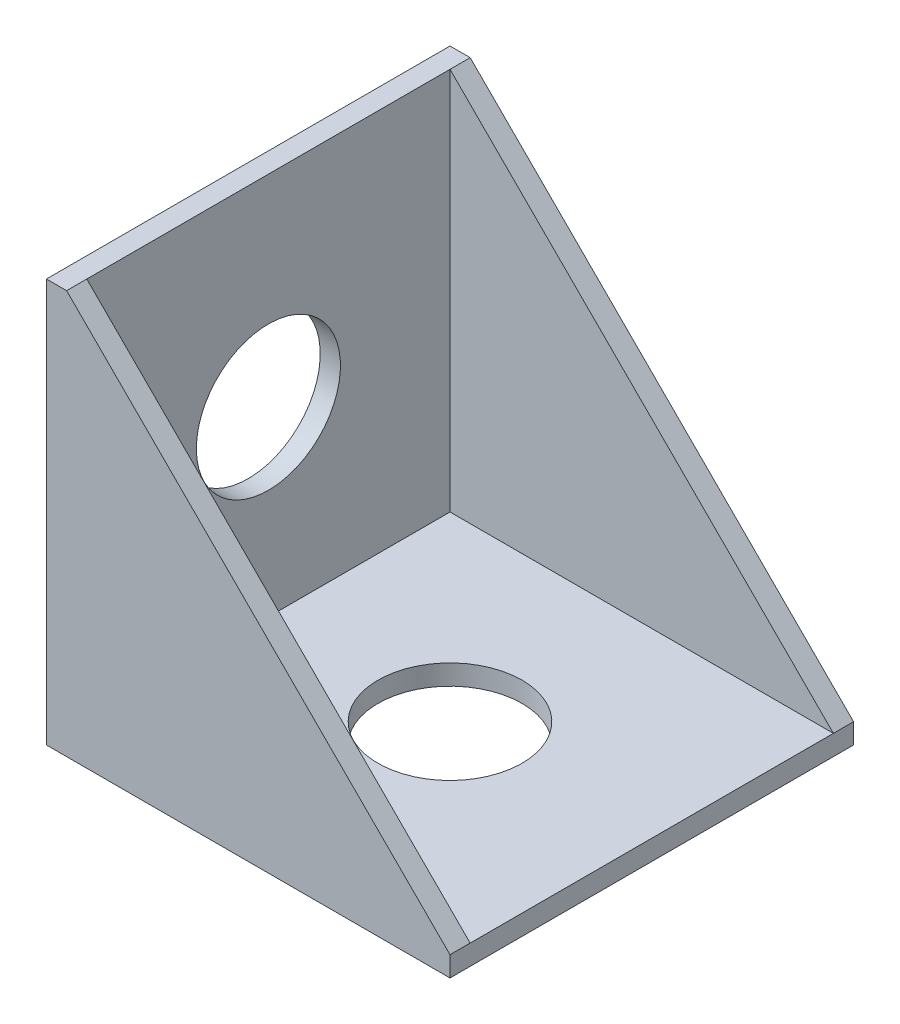
ISO-10303-21;
HEADER;
FILE_DESCRIPTION(('STEP AP214'),'2;1');
FILE_NAME('part.step','',(''),(''),'','','');
FILE_SCHEMA(('AUTOMOTIVE_DESIGN { 1 0 10303 214 1 1 1 1 }'));
ENDSEC;
DATA;
#1=APPLICATION_CONTEXT('core data for automotive mechanical design processes');
#2=APPLICATION_PROTOCOL_DEFINITION('international standard','automotive_design',2000,#1);
#3=PRODUCT_CONTEXT('',#1,'mechanical');
#4=PRODUCT('Part','Part','',(#3));
#5=PRODUCT_RELATED_PRODUCT_CATEGORY('part','',(#4));
#6=PRODUCT_DEFINITION_FORMATION('','',#4);
#7=PRODUCT_DEFINITION_CONTEXT('part definition',#1,'design');
#8=PRODUCT_DEFINITION('design','',#6,#7);
#9=PRODUCT_DEFINITION_SHAPE('','',#8);
#10=(LENGTH_UNIT() NAMED_UNIT(*) SI_UNIT(.MILLI.,.METRE.));
#11=(NAMED_UNIT(*) PLANE_ANGLE_UNIT() SI_UNIT($,.RADIAN.));
#12=(NAMED_UNIT(*) SI_UNIT($,.STERADIAN.) SOLID_ANGLE_UNIT());
#13=UNCERTAINTY_MEASURE_WITH_UNIT(LENGTH_MEASURE(1.E-05),#10,'distance_accuracy_value','');
#14=(GEOMETRIC_REPRESENTATION_CONTEXT(3) GLOBAL_UNCERTAINTY_ASSIGNED_CONTEXT((#13)) GLOBAL_UNIT_ASSIGNED_CONTEXT((#10,
#11,#12)) REPRESENTATION_CONTEXT('',''));
#15=CARTESIAN_POINT('',(0.,0.,0.));
#16=DIRECTION('',(0.,0.,1.));
#17=DIRECTION('',(1.,0.,0.));
#18=AXIS2_PLACEMENT_3D('',#15,#16,#17);
#19=CARTESIAN_POINT('',(20.,1.,0.));
#20=DIRECTION('',(0.707106781186547,0.707106781186548,0.));
#21=DIRECTION('',(0.,0.,-1.));
#22=AXIS2_PLACEMENT_3D('',#19,#20,#21);
#23=PLANE('',#22);
#24=DIRECTION('',(0.,0.,1.));
#25=VECTOR('',#24,1.);
#26=CARTESIAN_POINT('',(0.999999999999985,20.,0.));
#27=LINE('',#26,#25);
#28=CARTESIAN_POINT('',(0.999999999999985,20.,-10.));
#29=VERTEX_POINT('',#28);
#30=CARTESIAN_POINT('',(0.999999999999984,20.,-9.));
#31=VERTEX_POINT('',#30);
#32=EDGE_CURVE('E158',#29,#31,#27,.T.);
#33=ORIENTED_EDGE('',*,*,#32,.T.);
#34=DIRECTION('',(-0.707106781186548,0.707106781186547,0.));
#35=VECTOR('',#34,1.);
#36=CARTESIAN_POINT('',(20.,1.,-9.));
#37=LINE('',#36,#35);
#38=CARTESIAN_POINT('',(20.,1.,-9.));
#39=VERTEX_POINT('',#38);
#40=EDGE_CURVE('E48',#39,#31,#37,.T.);
#41=ORIENTED_EDGE('',*,*,#40,.F.);
#42=DIRECTION('',(0.,0.,1.));
#43=VECTOR('',#42,1.);
#44=CARTESIAN_POINT('',(20.,1.,0.));
#45=LINE('',#44,#43);
#46=CARTESIAN_POINT('',(20.,1.,-10.));
#47=VERTEX_POINT('',#46);
#48=EDGE_CURVE('E169',#47,#39,#45,.T.);
#49=ORIENTED_EDGE('',*,*,#48,.F.);
#50=DIRECTION('',(0.707106781186548,-0.707106781186547,0.));
#51=VECTOR('',#50,1.);
#52=CARTESIAN_POINT('',(20.,1.,-10.));
#53=LINE('',#52,#51);
#54=EDGE_CURVE('E175',#29,#47,#53,.T.);
#55=ORIENTED_EDGE('',*,*,#54,.F.);
#56=EDGE_LOOP('',(#33,#41,#49,#55));
#57=FACE_BOUND('',#56,.T.);
#58=ADVANCED_FACE('F40',(#57),#23,.T.);
#59=CARTESIAN_POINT('',(0.,10.,0.));
#60=DIRECTION('',(1.,0.,0.));
#61=DIRECTION('',(0.,0.,-1.));
#62=AXIS2_PLACEMENT_3D('',#59,#60,#61);
#63=CYLINDRICAL_SURFACE('',#62,3.57);
#64=CARTESIAN_POINT('',(0.999999999999985,10.,0.));
#65=DIRECTION('',(-1.,0.,0.));
#66=DIRECTION('',(0.,0.,1.));
#67=AXIS2_PLACEMENT_3D('',#64,#65,#66);
#68=CIRCLE('',#67,3.57);
#69=CARTESIAN_POINT('',(0.999999999999985,10.,3.57));
#70=VERTEX_POINT('',#69);
#71=EDGE_CURVE('E135',#70,#70,#68,.F.);
#72=ORIENTED_EDGE('',*,*,#71,.T.);
#73=EDGE_LOOP('',(#72));
#74=FACE_BOUND('',#73,.T.);
#75=CARTESIAN_POINT('',(0.,10.,0.));
#76=DIRECTION('',(1.,0.,0.));
#77=DIRECTION('',(0.,0.,-1.));
#78=AXIS2_PLACEMENT_3D('',#75,#76,#77);
#79=CIRCLE('',#78,3.57);
#80=CARTESIAN_POINT('',(0.,10.,3.57));
#81=VERTEX_POINT('',#80);
#82=EDGE_CURVE('E148',#81,#81,#79,.T.);
#83=ORIENTED_EDGE('',*,*,#82,.F.);
#84=EDGE_LOOP('',(#83));
#85=FACE_BOUND('',#84,.T.);
#86=ADVANCED_FACE('F42',(#74,#85),#63,.F.);
#87=CARTESIAN_POINT('',(10.,0.,0.));
#88=DIRECTION('',(0.,1.,0.));
#89=DIRECTION('',(-1.,0.,0.));
#90=AXIS2_PLACEMENT_3D('',#87,#88,#89);
#91=CYLINDRICAL_SURFACE('',#90,3.57);
#92=CARTESIAN_POINT('',(10.,1.,0.));
#93=DIRECTION('',(0.,-1.,0.));
#94=DIRECTION('',(0.,0.,-1.));
#95=AXIS2_PLACEMENT_3D('',#92,#93,#94);
#96=CIRCLE('',#95,3.57);
#97=CARTESIAN_POINT('',(10.,1.,-3.57));
#98=VERTEX_POINT('',#97);
#99=EDGE_CURVE('E117',#98,#98,#96,.F.);
#100=ORIENTED_EDGE('',*,*,#99,.T.);
#101=EDGE_LOOP('',(#100));
#102=FACE_BOUND('',#101,.T.);
#103=CARTESIAN_POINT('',(10.,0.,0.));
#104=DIRECTION('',(0.,1.,0.));
#105=DIRECTION('',(-1.,0.,0.));
#106=AXIS2_PLACEMENT_3D('',#103,#104,#105);
#107=CIRCLE('',#106,3.57);
#108=CARTESIAN_POINT('',(13.57,0.,0.));
#109=VERTEX_POINT('',#108);
#110=EDGE_CURVE('E164',#109,#109,#107,.T.);
#111=ORIENTED_EDGE('',*,*,#110,.F.);
#112=EDGE_LOOP('',(#111));
#113=FACE_BOUND('',#112,.T.);
#114=ADVANCED_FACE('F230',(#102,#113),#91,.F.);
#115=CARTESIAN_POINT('',(7.29831834890795,7.29831834890795,-10.));
#116=DIRECTION('',(0.,0.,-1.));
#117=DIRECTION('',(0.,-1.,0.));
#118=AXIS2_PLACEMENT_3D('',#115,#116,#117);
#119=PLANE('',#118);
#120=DIRECTION('',(-1.,0.,0.));
#121=VECTOR('',#120,1.);
#122=CARTESIAN_POINT('',(0.,0.,-10.));
#123=LINE('',#122,#121);
#124=CARTESIAN_POINT('',(20.,0.,-10.));
#125=VERTEX_POINT('',#124);
#126=CARTESIAN_POINT('',(0.,0.,-10.));
#127=VERTEX_POINT('',#126);
#128=EDGE_CURVE('E156',#125,#127,#123,.T.);
#129=ORIENTED_EDGE('',*,*,#128,.T.);
#130=DIRECTION('',(0.,1.,0.));
#131=VECTOR('',#130,1.);
#132=CARTESIAN_POINT('',(0.,20.,-10.));
#133=LINE('',#132,#131);
#134=CARTESIAN_POINT('',(0.,20.,-10.));
#135=VERTEX_POINT('',#134);
#136=EDGE_CURVE('E153',#127,#135,#133,.T.);
#137=ORIENTED_EDGE('',*,*,#136,.T.);
#138=DIRECTION('',(1.,0.,0.));
#139=VECTOR('',#138,1.);
#140=CARTESIAN_POINT('',(0.999999999999985,20.,-10.));
#141=LINE('',#140,#139);
#142=EDGE_CURVE('E157',#135,#29,#141,.T.);
#143=ORIENTED_EDGE('',*,*,#142,.T.);
#144=ORIENTED_EDGE('',*,*,#54,.T.);
#145=DIRECTION('',(0.,-1.,0.));
#146=VECTOR('',#145,1.);
#147=CARTESIAN_POINT('',(20.,0.,-10.));
#148=LINE('',#147,#146);
#149=EDGE_CURVE('E151',#47,#125,#148,.T.);
#150=ORIENTED_EDGE('',*,*,#149,.T.);
#151=EDGE_LOOP('',(#129,#137,#143,#144,#150));
#152=FACE_BOUND('',#151,.T.);
#153=ADVANCED_FACE('F243',(#152),#119,.T.);
#154=CARTESIAN_POINT('',(0.,20.,0.));
#155=DIRECTION('',(-1.,0.,0.));
#156=DIRECTION('',(0.,1.,0.));
#157=AXIS2_PLACEMENT_3D('',#154,#155,#156);
#158=PLANE('',#157);
#159=ORIENTED_EDGE('',*,*,#82,.T.);
#160=EDGE_LOOP('',(#159));
#161=FACE_BOUND('',#160,.T.);
#162=DIRECTION('',(0.,0.,-1.));
#163=VECTOR('',#162,1.);
#164=CARTESIAN_POINT('',(0.,0.,0.));
#165=LINE('',#164,#163);
#166=CARTESIAN_POINT('',(0.,0.,10.));
#167=VERTEX_POINT('',#166);
#168=EDGE_CURVE('E143',#167,#127,#165,.T.);
#169=ORIENTED_EDGE('',*,*,#168,.F.);
#170=DIRECTION('',(0.,-1.,0.));
#171=VECTOR('',#170,1.);
#172=CARTESIAN_POINT('',(0.,20.,10.));
#173=LINE('',#172,#171);
#174=CARTESIAN_POINT('',(0.,20.,10.));
#175=VERTEX_POINT('',#174);
#176=EDGE_CURVE('E142',#175,#167,#173,.T.);
#177=ORIENTED_EDGE('',*,*,#176,.F.);
#178=DIRECTION('',(0.,0.,1.));
#179=VECTOR('',#178,1.);
#180=CARTESIAN_POINT('',(0.,20.,0.));
#181=LINE('',#180,#179);
#182=EDGE_CURVE('E152',#135,#175,#181,.T.);
#183=ORIENTED_EDGE('',*,*,#182,.F.);
#184=ORIENTED_EDGE('',*,*,#136,.F.);
#185=EDGE_LOOP('',(#169,#177,#183,#184));
#186=FACE_BOUND('',#185,.T.);
#187=ADVANCED_FACE('F204',(#161,#186),#158,.T.);
#188=CARTESIAN_POINT('',(0.999999999999985,20.,0.));
#189=DIRECTION('',(0.,1.,0.));
#190=DIRECTION('',(1.,0.,0.));
#191=AXIS2_PLACEMENT_3D('',#188,#189,#190);
#192=PLANE('',#191);
#193=ORIENTED_EDGE('',*,*,#182,.T.);
#194=DIRECTION('',(-1.,0.,0.));
#195=VECTOR('',#194,1.);
#196=CARTESIAN_POINT('',(0.999999999999985,20.,10.));
#197=LINE('',#196,#195);
#198=CARTESIAN_POINT('',(0.999999999999985,20.,10.));
#199=VERTEX_POINT('',#198);
#200=EDGE_CURVE('E165',#199,#175,#197,.T.);
#201=ORIENTED_EDGE('',*,*,#200,.F.);
#202=CARTESIAN_POINT('',(0.999999999999985,20.,9.));
#203=VERTEX_POINT('',#202);
#204=EDGE_CURVE('E161',#203,#199,#27,.T.);
#205=ORIENTED_EDGE('',*,*,#204,.F.);
#206=DIRECTION('',(0.,0.,1.));
#207=VECTOR('',#206,1.);
#208=CARTESIAN_POINT('',(0.999999999999984,20.,-9.));
#209=LINE('',#208,#207);
#210=EDGE_CURVE('E130',#31,#203,#209,.T.);
#211=ORIENTED_EDGE('',*,*,#210,.F.);
#212=ORIENTED_EDGE('',*,*,#32,.F.);
#213=ORIENTED_EDGE('',*,*,#142,.F.);
#214=EDGE_LOOP('',(#193,#201,#205,#211,#212,#213));
#215=FACE_BOUND('',#214,.T.);
#216=ADVANCED_FACE('F199',(#215),#192,.T.);
#217=DIRECTION('',(0.707106781186548,-0.707106781186547,0.));
#218=VECTOR('',#217,1.);
#219=CARTESIAN_POINT('',(20.,0.999999999999999,9.));
#220=LINE('',#219,#218);
#221=CARTESIAN_POINT('',(20.,1.,9.));
#222=VERTEX_POINT('',#221);
#223=EDGE_CURVE('E11',#203,#222,#220,.T.);
#224=ORIENTED_EDGE('',*,*,#223,.F.);
#225=ORIENTED_EDGE('',*,*,#204,.T.);
#226=DIRECTION('',(-0.707106781186548,0.707106781186547,0.));
#227=VECTOR('',#226,1.);
#228=CARTESIAN_POINT('',(20.,1.,10.));
#229=LINE('',#228,#227);
#230=CARTESIAN_POINT('',(20.,1.,10.));
#231=VERTEX_POINT('',#230);
#232=EDGE_CURVE('E168',#231,#199,#229,.T.);
#233=ORIENTED_EDGE('',*,*,#232,.F.);
#234=EDGE_CURVE('E172',#222,#231,#45,.T.);
#235=ORIENTED_EDGE('',*,*,#234,.F.);
#236=EDGE_LOOP('',(#224,#225,#233,#235));
#237=FACE_BOUND('',#236,.T.);
#238=ADVANCED_FACE('F196',(#237),#23,.T.);
#239=CARTESIAN_POINT('',(20.,0.,0.));
#240=DIRECTION('',(1.,0.,0.));
#241=DIRECTION('',(0.,1.,0.));
#242=AXIS2_PLACEMENT_3D('',#239,#240,#241);
#243=PLANE('',#242);
#244=ORIENTED_EDGE('',*,*,#48,.T.);
#245=DIRECTION('',(0.,0.,-1.));
#246=VECTOR('',#245,1.);
#247=CARTESIAN_POINT('',(20.,1.,9.));
#248=LINE('',#247,#246);
#249=EDGE_CURVE('E113',#222,#39,#248,.T.);
#250=ORIENTED_EDGE('',*,*,#249,.F.);
#251=ORIENTED_EDGE('',*,*,#234,.T.);
#252=DIRECTION('',(0.,1.,0.));
#253=VECTOR('',#252,1.);
#254=CARTESIAN_POINT('',(20.,0.,10.));
#255=LINE('',#254,#253);
#256=CARTESIAN_POINT('',(20.,0.,10.));
#257=VERTEX_POINT('',#256);
#258=EDGE_CURVE('E184',#257,#231,#255,.T.);
#259=ORIENTED_EDGE('',*,*,#258,.F.);
#260=DIRECTION('',(0.,0.,1.));
#261=VECTOR('',#260,1.);
#262=CARTESIAN_POINT('',(20.,0.,0.));
#263=LINE('',#262,#261);
#264=EDGE_CURVE('E146',#125,#257,#263,.T.);
#265=ORIENTED_EDGE('',*,*,#264,.F.);
#266=ORIENTED_EDGE('',*,*,#149,.F.);
#267=EDGE_LOOP('',(#244,#250,#251,#259,#265,#266));
#268=FACE_BOUND('',#267,.T.);
#269=ADVANCED_FACE('F211',(#268),#243,.T.);
#270=CARTESIAN_POINT('',(0.,0.,0.));
#271=DIRECTION('',(0.,-1.,0.));
#272=DIRECTION('',(0.,0.,-1.));
#273=AXIS2_PLACEMENT_3D('',#270,#271,#272);
#274=PLANE('',#273);
#275=ORIENTED_EDGE('',*,*,#110,.T.);
#276=EDGE_LOOP('',(#275));
#277=FACE_BOUND('',#276,.T.);
#278=ORIENTED_EDGE('',*,*,#264,.T.);
#279=DIRECTION('',(1.,0.,0.));
#280=VECTOR('',#279,1.);
#281=CARTESIAN_POINT('',(0.,0.,10.));
#282=LINE('',#281,#280);
#283=EDGE_CURVE('E147',#167,#257,#282,.T.);
#284=ORIENTED_EDGE('',*,*,#283,.F.);
#285=ORIENTED_EDGE('',*,*,#168,.T.);
#286=ORIENTED_EDGE('',*,*,#128,.F.);
#287=EDGE_LOOP('',(#278,#284,#285,#286));
#288=FACE_BOUND('',#287,.T.);
#289=ADVANCED_FACE('F207',(#277,#288),#274,.T.);
#290=CARTESIAN_POINT('',(7.29831834890795,7.29831834890795,10.));
#291=DIRECTION('',(0.,0.,1.));
#292=DIRECTION('',(1.,0.,0.));
#293=AXIS2_PLACEMENT_3D('',#290,#291,#292);
#294=PLANE('',#293);
#295=ORIENTED_EDGE('',*,*,#283,.T.);
#296=ORIENTED_EDGE('',*,*,#258,.T.);
#297=ORIENTED_EDGE('',*,*,#232,.T.);
#298=ORIENTED_EDGE('',*,*,#200,.T.);
#299=ORIENTED_EDGE('',*,*,#176,.T.);
#300=EDGE_LOOP('',(#295,#296,#297,#298,#299));
#301=FACE_BOUND('',#300,.T.);
#302=ADVANCED_FACE('F194',(#301),#294,.T.);
#303=CARTESIAN_POINT('',(-22.6725046566048,1.,9.));
#304=DIRECTION('',(0.,-1.,0.));
#305=DIRECTION('',(0.,0.,-1.));
#306=AXIS2_PLACEMENT_3D('',#303,#304,#305);
#307=PLANE('',#306);
#308=DIRECTION('',(1.,0.,0.));
#309=VECTOR('',#308,1.);
#310=CARTESIAN_POINT('',(-22.6725046566048,1.,9.));
#311=LINE('',#310,#309);
#312=CARTESIAN_POINT('',(0.999999999999985,1.,9.));
#313=VERTEX_POINT('',#312);
#314=EDGE_CURVE('E61',#313,#222,#311,.T.);
#315=ORIENTED_EDGE('',*,*,#314,.T.);
#316=ORIENTED_EDGE('',*,*,#249,.T.);
#317=DIRECTION('',(1.,0.,0.));
#318=VECTOR('',#317,1.);
#319=CARTESIAN_POINT('',(-22.6725046566048,1.,-9.));
#320=LINE('',#319,#318);
#321=CARTESIAN_POINT('',(0.999999999999984,1.,-9.));
#322=VERTEX_POINT('',#321);
#323=EDGE_CURVE('E107',#322,#39,#320,.T.);
#324=ORIENTED_EDGE('',*,*,#323,.F.);
#325=DIRECTION('',(0.,0.,1.));
#326=VECTOR('',#325,1.);
#327=CARTESIAN_POINT('',(0.999999999999984,1.,-9.));
#328=LINE('',#327,#326);
#329=EDGE_CURVE('E111',#322,#313,#328,.T.);
#330=ORIENTED_EDGE('',*,*,#329,.T.);
#331=EDGE_LOOP('',(#315,#316,#324,#330));
#332=FACE_BOUND('',#331,.T.);
#333=ORIENTED_EDGE('',*,*,#99,.F.);
#334=EDGE_LOOP('',(#333));
#335=FACE_BOUND('',#334,.T.);
#336=ADVANCED_FACE('F109',(#332,#335),#307,.F.);
#337=CARTESIAN_POINT('',(-22.6725046566048,20.,9.));
#338=DIRECTION('',(0.,0.,1.));
#339=DIRECTION('',(0.,-1.,0.));
#340=AXIS2_PLACEMENT_3D('',#337,#338,#339);
#341=PLANE('',#340);
#342=ORIENTED_EDGE('',*,*,#223,.T.);
#343=ORIENTED_EDGE('',*,*,#314,.F.);
#344=DIRECTION('',(0.,1.,0.));
#345=VECTOR('',#344,1.);
#346=CARTESIAN_POINT('',(0.999999999999985,-25.1725046566048,9.));
#347=LINE('',#346,#345);
#348=EDGE_CURVE('E127',#313,#203,#347,.T.);
#349=ORIENTED_EDGE('',*,*,#348,.T.);
#350=EDGE_LOOP('',(#342,#343,#349));
#351=FACE_BOUND('',#350,.T.);
#352=ADVANCED_FACE('F215',(#351),#341,.F.);
#353=CARTESIAN_POINT('',(-22.6725046566048,1.,-9.));
#354=DIRECTION('',(0.,0.,-1.));
#355=DIRECTION('',(0.,1.,0.));
#356=AXIS2_PLACEMENT_3D('',#353,#354,#355);
#357=PLANE('',#356);
#358=ORIENTED_EDGE('',*,*,#40,.T.);
#359=DIRECTION('',(0.,1.,0.));
#360=VECTOR('',#359,1.);
#361=CARTESIAN_POINT('',(0.999999999999984,-25.1725046566048,-9.));
#362=LINE('',#361,#360);
#363=EDGE_CURVE('E124',#322,#31,#362,.T.);
#364=ORIENTED_EDGE('',*,*,#363,.F.);
#365=ORIENTED_EDGE('',*,*,#323,.T.);
#366=EDGE_LOOP('',(#358,#364,#365));
#367=FACE_BOUND('',#366,.T.);
#368=ADVANCED_FACE('F129',(#367),#357,.F.);
#369=CARTESIAN_POINT('',(0.999999999999984,-25.1725046566048,-9.));
#370=DIRECTION('',(-1.,0.,0.));
#371=DIRECTION('',(0.,0.,1.));
#372=AXIS2_PLACEMENT_3D('',#369,#370,#371);
#373=PLANE('',#372);
#374=ORIENTED_EDGE('',*,*,#363,.T.);
#375=ORIENTED_EDGE('',*,*,#210,.T.);
#376=ORIENTED_EDGE('',*,*,#348,.F.);
#377=ORIENTED_EDGE('',*,*,#329,.F.);
#378=EDGE_LOOP('',(#374,#375,#376,#377));
#379=FACE_BOUND('',#378,.T.);
#380=ORIENTED_EDGE('',*,*,#71,.F.);
#381=EDGE_LOOP('',(#380));
#382=FACE_BOUND('',#381,.T.);
#383=ADVANCED_FACE('F122',(#379,#382),#373,.F.);
#384=CLOSED_SHELL('',(#58,#86,#114,#153,#187,#216,#238,#269,#289,#302,#336,#352,#368,#383));
#385=MANIFOLD_SOLID_BREP('B2',#384);
#386=ADVANCED_BREP_SHAPE_REPRESENTATION('',(#18,#385),#14);
#387=SHAPE_DEFINITION_REPRESENTATION(#9,#386);
ENDSEC;
END-ISO-10303-21;
